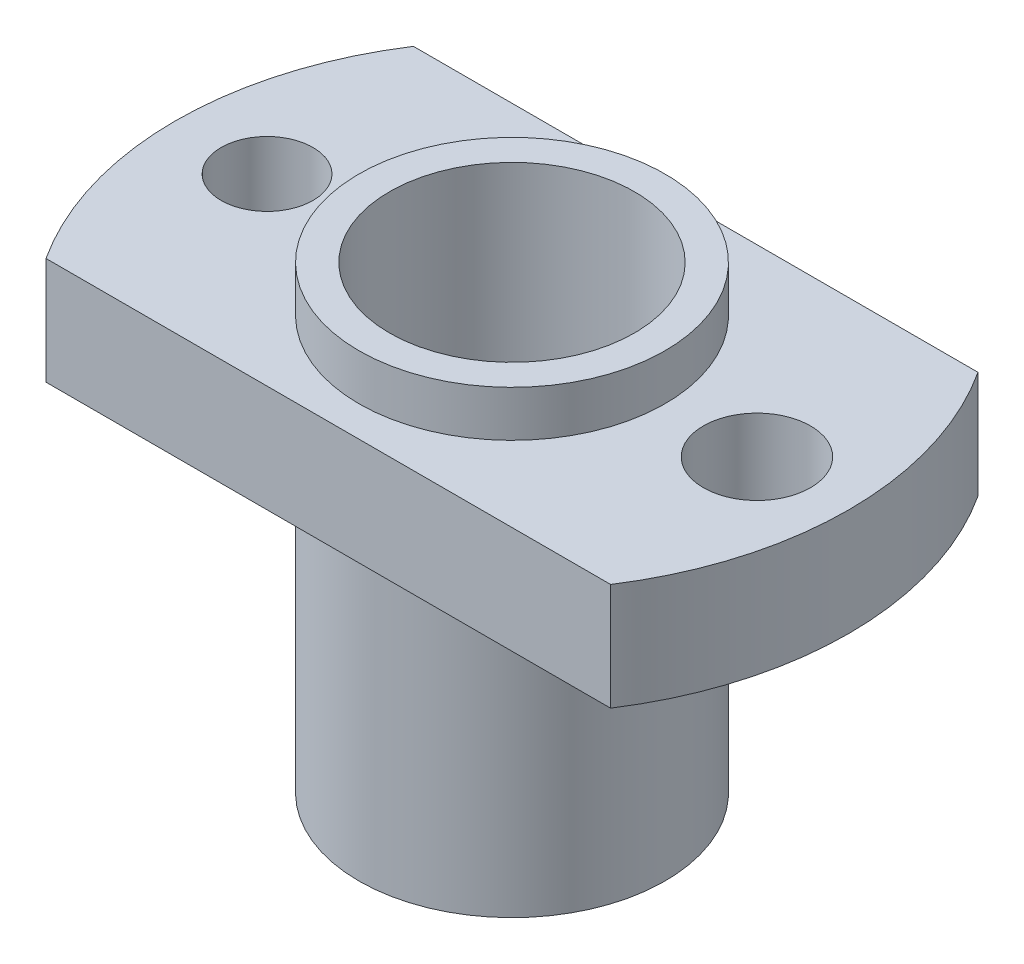
ISO-10303-21;
HEADER;
FILE_DESCRIPTION(('STEP AP214'),'2;1');
FILE_NAME('part.step','',(''),(''),'','','');
FILE_SCHEMA(('AUTOMOTIVE_DESIGN { 1 0 10303 214 1 1 1 1 }'));
ENDSEC;
DATA;
#1=APPLICATION_CONTEXT('core data for automotive mechanical design processes');
#2=APPLICATION_PROTOCOL_DEFINITION('international standard','automotive_design',2000,#1);
#3=PRODUCT_CONTEXT('',#1,'mechanical');
#4=PRODUCT('Part','Part','',(#3));
#5=PRODUCT_RELATED_PRODUCT_CATEGORY('part','',(#4));
#6=PRODUCT_DEFINITION_FORMATION('','',#4);
#7=PRODUCT_DEFINITION_CONTEXT('part definition',#1,'design');
#8=PRODUCT_DEFINITION('design','',#6,#7);
#9=PRODUCT_DEFINITION_SHAPE('','',#8);
#10=(LENGTH_UNIT() NAMED_UNIT(*) SI_UNIT(.MILLI.,.METRE.));
#11=(NAMED_UNIT(*) PLANE_ANGLE_UNIT() SI_UNIT($,.RADIAN.));
#12=(NAMED_UNIT(*) SI_UNIT($,.STERADIAN.) SOLID_ANGLE_UNIT());
#13=UNCERTAINTY_MEASURE_WITH_UNIT(LENGTH_MEASURE(1.E-05),#10,'distance_accuracy_value','');
#14=(GEOMETRIC_REPRESENTATION_CONTEXT(3) GLOBAL_UNCERTAINTY_ASSIGNED_CONTEXT((#13)) GLOBAL_UNIT_ASSIGNED_CONTEXT((#10,
#11,#12)) REPRESENTATION_CONTEXT('',''));
#15=CARTESIAN_POINT('',(0.,0.,0.));
#16=DIRECTION('',(0.,0.,1.));
#17=DIRECTION('',(1.,0.,0.));
#18=AXIS2_PLACEMENT_3D('',#15,#16,#17);
#19=CARTESIAN_POINT('',(0.,3.5,0.));
#20=DIRECTION('',(0.,-1.,0.));
#21=DIRECTION('',(0.,0.,-1.));
#22=AXIS2_PLACEMENT_3D('',#19,#20,#21);
#23=CYLINDRICAL_SURFACE('',#22,11.);
#24=CARTESIAN_POINT('',(0.,0.,0.));
#25=DIRECTION('',(0.,1.,0.));
#26=DIRECTION('',(0.,0.,1.));
#27=AXIS2_PLACEMENT_3D('',#24,#25,#26);
#28=CIRCLE('',#27,11.);
#29=CARTESIAN_POINT('',(-9.21954445729289,0.,-6.));
#30=VERTEX_POINT('',#29);
#31=CARTESIAN_POINT('',(-9.21954445729289,0.,6.));
#32=VERTEX_POINT('',#31);
#33=EDGE_CURVE('E102',#30,#32,#28,.T.);
#34=ORIENTED_EDGE('',*,*,#33,.T.);
#35=DIRECTION('',(0.,-1.,0.));
#36=VECTOR('',#35,1.);
#37=CARTESIAN_POINT('',(-9.21954445729289,3.5,6.));
#38=LINE('',#37,#36);
#39=CARTESIAN_POINT('',(-9.21954445729289,3.5,6.));
#40=VERTEX_POINT('',#39);
#41=EDGE_CURVE('E11',#40,#32,#38,.T.);
#42=ORIENTED_EDGE('',*,*,#41,.F.);
#43=CARTESIAN_POINT('',(0.,3.5,0.));
#44=DIRECTION('',(0.,1.,0.));
#45=DIRECTION('',(0.,0.,1.));
#46=AXIS2_PLACEMENT_3D('',#43,#44,#45);
#47=CIRCLE('',#46,11.);
#48=CARTESIAN_POINT('',(-9.21954445729289,3.5,-6.));
#49=VERTEX_POINT('',#48);
#50=EDGE_CURVE('E90',#49,#40,#47,.T.);
#51=ORIENTED_EDGE('',*,*,#50,.F.);
#52=DIRECTION('',(0.,-1.,0.));
#53=VECTOR('',#52,1.);
#54=CARTESIAN_POINT('',(-9.21954445729289,3.5,-6.));
#55=LINE('',#54,#53);
#56=EDGE_CURVE('E98',#49,#30,#55,.T.);
#57=ORIENTED_EDGE('',*,*,#56,.T.);
#58=EDGE_LOOP('',(#34,#42,#51,#57));
#59=FACE_BOUND('',#58,.T.);
#60=ADVANCED_FACE('F39',(#59),#23,.T.);
#61=CARTESIAN_POINT('',(-9.21954445729289,3.5,6.));
#62=DIRECTION('',(0.,0.,-1.));
#63=DIRECTION('',(-1.,0.,0.));
#64=AXIS2_PLACEMENT_3D('',#61,#62,#63);
#65=PLANE('',#64);
#66=DIRECTION('',(1.,0.,0.));
#67=VECTOR('',#66,1.);
#68=CARTESIAN_POINT('',(-9.21954445729289,0.,6.));
#69=LINE('',#68,#67);
#70=CARTESIAN_POINT('',(9.21954445729289,0.,6.));
#71=VERTEX_POINT('',#70);
#72=EDGE_CURVE('E94',#32,#71,#69,.T.);
#73=ORIENTED_EDGE('',*,*,#72,.T.);
#74=DIRECTION('',(0.,-1.,0.));
#75=VECTOR('',#74,1.);
#76=CARTESIAN_POINT('',(9.21954445729289,3.5,6.));
#77=LINE('',#76,#75);
#78=CARTESIAN_POINT('',(9.21954445729289,3.5,6.));
#79=VERTEX_POINT('',#78);
#80=EDGE_CURVE('E47',#79,#71,#77,.T.);
#81=ORIENTED_EDGE('',*,*,#80,.F.);
#82=DIRECTION('',(1.,0.,0.));
#83=VECTOR('',#82,1.);
#84=CARTESIAN_POINT('',(-9.21954445729289,3.5,6.));
#85=LINE('',#84,#83);
#86=EDGE_CURVE('E85',#40,#79,#85,.T.);
#87=ORIENTED_EDGE('',*,*,#86,.F.);
#88=ORIENTED_EDGE('',*,*,#41,.T.);
#89=EDGE_LOOP('',(#73,#81,#87,#88));
#90=FACE_BOUND('',#89,.T.);
#91=ADVANCED_FACE('F93',(#90),#65,.F.);
#92=CARTESIAN_POINT('',(0.,3.5,0.));
#93=DIRECTION('',(0.,-1.,0.));
#94=DIRECTION('',(0.,0.,-1.));
#95=AXIS2_PLACEMENT_3D('',#92,#93,#94);
#96=CYLINDRICAL_SURFACE('',#95,11.);
#97=CARTESIAN_POINT('',(0.,0.,0.));
#98=DIRECTION('',(0.,1.,0.));
#99=DIRECTION('',(0.,0.,1.));
#100=AXIS2_PLACEMENT_3D('',#97,#98,#99);
#101=CIRCLE('',#100,11.);
#102=CARTESIAN_POINT('',(9.21954445729289,0.,-6.));
#103=VERTEX_POINT('',#102);
#104=EDGE_CURVE('E72',#71,#103,#101,.T.);
#105=ORIENTED_EDGE('',*,*,#104,.T.);
#106=DIRECTION('',(0.,-1.,0.));
#107=VECTOR('',#106,1.);
#108=CARTESIAN_POINT('',(9.21954445729289,3.5,-6.));
#109=LINE('',#108,#107);
#110=CARTESIAN_POINT('',(9.21954445729289,3.5,-6.));
#111=VERTEX_POINT('',#110);
#112=EDGE_CURVE('E95',#111,#103,#109,.T.);
#113=ORIENTED_EDGE('',*,*,#112,.F.);
#114=CARTESIAN_POINT('',(0.,3.5,0.));
#115=DIRECTION('',(0.,1.,0.));
#116=DIRECTION('',(0.,0.,1.));
#117=AXIS2_PLACEMENT_3D('',#114,#115,#116);
#118=CIRCLE('',#117,11.);
#119=EDGE_CURVE('E88',#79,#111,#118,.T.);
#120=ORIENTED_EDGE('',*,*,#119,.F.);
#121=ORIENTED_EDGE('',*,*,#80,.T.);
#122=EDGE_LOOP('',(#105,#113,#120,#121));
#123=FACE_BOUND('',#122,.T.);
#124=ADVANCED_FACE('F96',(#123),#96,.T.);
#125=CARTESIAN_POINT('',(-9.21954445729289,3.5,-6.));
#126=DIRECTION('',(0.,0.,1.));
#127=DIRECTION('',(1.,0.,0.));
#128=AXIS2_PLACEMENT_3D('',#125,#126,#127);
#129=PLANE('',#128);
#130=DIRECTION('',(-1.,0.,0.));
#131=VECTOR('',#130,1.);
#132=CARTESIAN_POINT('',(-9.21954445729289,0.,-6.));
#133=LINE('',#132,#131);
#134=EDGE_CURVE('E78',#103,#30,#133,.T.);
#135=ORIENTED_EDGE('',*,*,#134,.T.);
#136=ORIENTED_EDGE('',*,*,#56,.F.);
#137=DIRECTION('',(-1.,0.,0.));
#138=VECTOR('',#137,1.);
#139=CARTESIAN_POINT('',(-9.21954445729289,3.5,-6.));
#140=LINE('',#139,#138);
#141=EDGE_CURVE('E55',#111,#49,#140,.T.);
#142=ORIENTED_EDGE('',*,*,#141,.F.);
#143=ORIENTED_EDGE('',*,*,#112,.T.);
#144=EDGE_LOOP('',(#135,#136,#142,#143));
#145=FACE_BOUND('',#144,.T.);
#146=ADVANCED_FACE('F110',(#145),#129,.F.);
#147=CARTESIAN_POINT('',(0.,3.5,0.));
#148=DIRECTION('',(0.,1.,0.));
#149=DIRECTION('',(0.,0.,1.));
#150=AXIS2_PLACEMENT_3D('',#147,#148,#149);
#151=PLANE('',#150);
#152=CARTESIAN_POINT('',(0.,3.5,0.));
#153=DIRECTION('',(0.,1.,0.));
#154=DIRECTION('',(0.,0.,1.));
#155=AXIS2_PLACEMENT_3D('',#152,#153,#154);
#156=CIRCLE('',#155,5.);
#157=CARTESIAN_POINT('',(0.,3.5,5.));
#158=VERTEX_POINT('',#157);
#159=EDGE_CURVE('E134',#158,#158,#156,.T.);
#160=ORIENTED_EDGE('',*,*,#159,.F.);
#161=EDGE_LOOP('',(#160));
#162=FACE_BOUND('',#161,.T.);
#163=CARTESIAN_POINT('',(8.,3.5,0.));
#164=DIRECTION('',(0.,1.,0.));
#165=DIRECTION('',(0.,0.,1.));
#166=AXIS2_PLACEMENT_3D('',#163,#164,#165);
#167=CIRCLE('',#166,1.75);
#168=CARTESIAN_POINT('',(8.,3.5,1.75));
#169=VERTEX_POINT('',#168);
#170=EDGE_CURVE('E119',#169,#169,#167,.T.);
#171=ORIENTED_EDGE('',*,*,#170,.F.);
#172=EDGE_LOOP('',(#171));
#173=FACE_BOUND('',#172,.T.);
#174=CARTESIAN_POINT('',(-8.,3.5,0.));
#175=DIRECTION('',(0.,1.,0.));
#176=DIRECTION('',(0.,0.,1.));
#177=AXIS2_PLACEMENT_3D('',#174,#175,#176);
#178=CIRCLE('',#177,1.5);
#179=CARTESIAN_POINT('',(-8.,3.5,1.5));
#180=VERTEX_POINT('',#179);
#181=EDGE_CURVE('E120',#180,#180,#178,.T.);
#182=ORIENTED_EDGE('',*,*,#181,.F.);
#183=EDGE_LOOP('',(#182));
#184=FACE_BOUND('',#183,.T.);
#185=ORIENTED_EDGE('',*,*,#50,.T.);
#186=ORIENTED_EDGE('',*,*,#86,.T.);
#187=ORIENTED_EDGE('',*,*,#119,.T.);
#188=ORIENTED_EDGE('',*,*,#141,.T.);
#189=EDGE_LOOP('',(#185,#186,#187,#188));
#190=FACE_BOUND('',#189,.T.);
#191=ADVANCED_FACE('F86',(#162,#173,#184,#190),#151,.T.);
#192=CARTESIAN_POINT('',(0.,0.,0.));
#193=DIRECTION('',(0.,1.,0.));
#194=DIRECTION('',(0.,0.,1.));
#195=AXIS2_PLACEMENT_3D('',#192,#193,#194);
#196=PLANE('',#195);
#197=CARTESIAN_POINT('',(0.,0.,0.));
#198=DIRECTION('',(0.,1.,0.));
#199=DIRECTION('',(0.,0.,1.));
#200=AXIS2_PLACEMENT_3D('',#197,#198,#199);
#201=CIRCLE('',#200,5.);
#202=CARTESIAN_POINT('',(0.,0.,5.));
#203=VERTEX_POINT('',#202);
#204=EDGE_CURVE('E128',#203,#203,#201,.T.);
#205=ORIENTED_EDGE('',*,*,#204,.T.);
#206=EDGE_LOOP('',(#205));
#207=FACE_BOUND('',#206,.T.);
#208=CARTESIAN_POINT('',(8.,0.,0.));
#209=DIRECTION('',(0.,1.,0.));
#210=DIRECTION('',(0.,0.,1.));
#211=AXIS2_PLACEMENT_3D('',#208,#209,#210);
#212=CIRCLE('',#211,1.75);
#213=CARTESIAN_POINT('',(8.,0.,1.75));
#214=VERTEX_POINT('',#213);
#215=EDGE_CURVE('E105',#214,#214,#212,.F.);
#216=ORIENTED_EDGE('',*,*,#215,.F.);
#217=EDGE_LOOP('',(#216));
#218=FACE_BOUND('',#217,.T.);
#219=CARTESIAN_POINT('',(-8.,0.,0.));
#220=DIRECTION('',(0.,1.,0.));
#221=DIRECTION('',(0.,0.,1.));
#222=AXIS2_PLACEMENT_3D('',#219,#220,#221);
#223=CIRCLE('',#222,1.5);
#224=CARTESIAN_POINT('',(-8.,0.,1.5));
#225=VERTEX_POINT('',#224);
#226=EDGE_CURVE('E116',#225,#225,#223,.F.);
#227=ORIENTED_EDGE('',*,*,#226,.F.);
#228=EDGE_LOOP('',(#227));
#229=FACE_BOUND('',#228,.T.);
#230=ORIENTED_EDGE('',*,*,#33,.F.);
#231=ORIENTED_EDGE('',*,*,#134,.F.);
#232=ORIENTED_EDGE('',*,*,#104,.F.);
#233=ORIENTED_EDGE('',*,*,#72,.F.);
#234=EDGE_LOOP('',(#230,#231,#232,#233));
#235=FACE_BOUND('',#234,.T.);
#236=ADVANCED_FACE('F113',(#207,#218,#229,#235),#196,.F.);
#237=CARTESIAN_POINT('',(-8.,-4.94974746830583,0.));
#238=DIRECTION('',(0.,1.,0.));
#239=DIRECTION('',(0.,0.,1.));
#240=AXIS2_PLACEMENT_3D('',#237,#238,#239);
#241=CYLINDRICAL_SURFACE('',#240,1.5);
#242=ORIENTED_EDGE('',*,*,#226,.T.);
#243=EDGE_LOOP('',(#242));
#244=FACE_BOUND('',#243,.T.);
#245=ORIENTED_EDGE('',*,*,#181,.T.);
#246=EDGE_LOOP('',(#245));
#247=FACE_BOUND('',#246,.T.);
#248=ADVANCED_FACE('F174',(#244,#247),#241,.F.);
#249=CARTESIAN_POINT('',(8.,-4.94974746830583,0.));
#250=DIRECTION('',(0.,1.,0.));
#251=DIRECTION('',(0.,0.,1.));
#252=AXIS2_PLACEMENT_3D('',#249,#250,#251);
#253=CYLINDRICAL_SURFACE('',#252,1.75);
#254=ORIENTED_EDGE('',*,*,#215,.T.);
#255=EDGE_LOOP('',(#254));
#256=FACE_BOUND('',#255,.T.);
#257=ORIENTED_EDGE('',*,*,#170,.T.);
#258=EDGE_LOOP('',(#257));
#259=FACE_BOUND('',#258,.T.);
#260=ADVANCED_FACE('F176',(#256,#259),#253,.F.);
#261=CARTESIAN_POINT('',(0.,-10.,0.));
#262=DIRECTION('',(0.,1.,0.));
#263=DIRECTION('',(0.,0.,1.));
#264=AXIS2_PLACEMENT_3D('',#261,#262,#263);
#265=CYLINDRICAL_SURFACE('',#264,5.);
#266=CARTESIAN_POINT('',(0.,-10.,0.));
#267=DIRECTION('',(0.,1.,0.));
#268=DIRECTION('',(0.,0.,1.));
#269=AXIS2_PLACEMENT_3D('',#266,#267,#268);
#270=CIRCLE('',#269,5.);
#271=CARTESIAN_POINT('',(0.,-10.,5.));
#272=VERTEX_POINT('',#271);
#273=EDGE_CURVE('E123',#272,#272,#270,.T.);
#274=ORIENTED_EDGE('',*,*,#273,.T.);
#275=EDGE_LOOP('',(#274));
#276=FACE_BOUND('',#275,.T.);
#277=ORIENTED_EDGE('',*,*,#204,.F.);
#278=EDGE_LOOP('',(#277));
#279=FACE_BOUND('',#278,.T.);
#280=ADVANCED_FACE('F183',(#276,#279),#265,.T.);
#281=CARTESIAN_POINT('',(0.,-10.,0.));
#282=DIRECTION('',(0.,1.,0.));
#283=DIRECTION('',(0.,0.,1.));
#284=AXIS2_PLACEMENT_3D('',#281,#282,#283);
#285=PLANE('',#284);
#286=CARTESIAN_POINT('',(0.,-10.,0.));
#287=DIRECTION('',(0.,1.,0.));
#288=DIRECTION('',(0.,0.,1.));
#289=AXIS2_PLACEMENT_3D('',#286,#287,#288);
#290=CIRCLE('',#289,4.);
#291=CARTESIAN_POINT('',(0.,-10.,4.));
#292=VERTEX_POINT('',#291);
#293=EDGE_CURVE('E142',#292,#292,#290,.T.);
#294=ORIENTED_EDGE('',*,*,#293,.T.);
#295=EDGE_LOOP('',(#294));
#296=FACE_BOUND('',#295,.T.);
#297=ORIENTED_EDGE('',*,*,#273,.F.);
#298=EDGE_LOOP('',(#297));
#299=FACE_BOUND('',#298,.T.);
#300=ADVANCED_FACE('F146',(#296,#299),#285,.F.);
#301=CARTESIAN_POINT('',(0.,5.,0.));
#302=DIRECTION('',(0.,-1.,0.));
#303=DIRECTION('',(0.,0.,-1.));
#304=AXIS2_PLACEMENT_3D('',#301,#302,#303);
#305=CYLINDRICAL_SURFACE('',#304,5.);
#306=CARTESIAN_POINT('',(0.,5.,0.));
#307=DIRECTION('',(0.,1.,0.));
#308=DIRECTION('',(0.,0.,1.));
#309=AXIS2_PLACEMENT_3D('',#306,#307,#308);
#310=CIRCLE('',#309,5.);
#311=CARTESIAN_POINT('',(0.,5.,5.));
#312=VERTEX_POINT('',#311);
#313=EDGE_CURVE('E131',#312,#312,#310,.T.);
#314=ORIENTED_EDGE('',*,*,#313,.F.);
#315=EDGE_LOOP('',(#314));
#316=FACE_BOUND('',#315,.T.);
#317=ORIENTED_EDGE('',*,*,#159,.T.);
#318=EDGE_LOOP('',(#317));
#319=FACE_BOUND('',#318,.T.);
#320=ADVANCED_FACE('F158',(#316,#319),#305,.T.);
#321=CARTESIAN_POINT('',(0.,5.,0.));
#322=DIRECTION('',(0.,1.,0.));
#323=DIRECTION('',(0.,0.,1.));
#324=AXIS2_PLACEMENT_3D('',#321,#322,#323);
#325=PLANE('',#324);
#326=CARTESIAN_POINT('',(0.,5.,0.));
#327=DIRECTION('',(0.,1.,0.));
#328=DIRECTION('',(0.,0.,1.));
#329=AXIS2_PLACEMENT_3D('',#326,#327,#328);
#330=CIRCLE('',#329,4.);
#331=CARTESIAN_POINT('',(0.,5.,4.));
#332=VERTEX_POINT('',#331);
#333=EDGE_CURVE('E137',#332,#332,#330,.T.);
#334=ORIENTED_EDGE('',*,*,#333,.F.);
#335=EDGE_LOOP('',(#334));
#336=FACE_BOUND('',#335,.T.);
#337=ORIENTED_EDGE('',*,*,#313,.T.);
#338=EDGE_LOOP('',(#337));
#339=FACE_BOUND('',#338,.T.);
#340=ADVANCED_FACE('F152',(#336,#339),#325,.T.);
#341=CARTESIAN_POINT('',(0.,16.3137084989848,0.));
#342=DIRECTION('',(0.,-1.,0.));
#343=DIRECTION('',(0.,0.,-1.));
#344=AXIS2_PLACEMENT_3D('',#341,#342,#343);
#345=CYLINDRICAL_SURFACE('',#344,4.);
#346=ORIENTED_EDGE('',*,*,#293,.F.);
#347=EDGE_LOOP('',(#346));
#348=FACE_BOUND('',#347,.T.);
#349=ORIENTED_EDGE('',*,*,#333,.T.);
#350=EDGE_LOOP('',(#349));
#351=FACE_BOUND('',#350,.T.);
#352=ADVANCED_FACE('F149',(#348,#351),#345,.F.);
#353=CLOSED_SHELL('',(#60,#91,#124,#146,#191,#236,#248,#260,#280,#300,#320,#340,#352));
#354=MANIFOLD_SOLID_BREP('B2',#353);
#355=ADVANCED_BREP_SHAPE_REPRESENTATION('',(#18,#354),#14);
#356=SHAPE_DEFINITION_REPRESENTATION(#9,#355);
ENDSEC;
END-ISO-10303-21;
